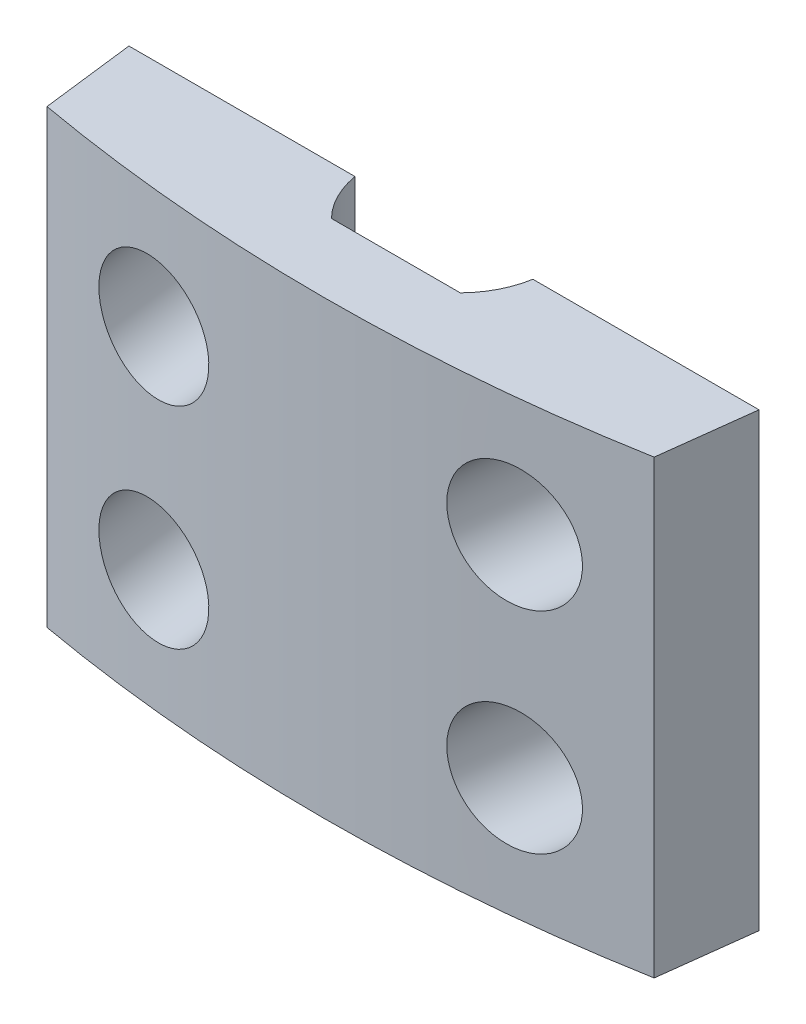
ISO-10303-21;
HEADER;
FILE_DESCRIPTION(('STEP AP214'),'2;1');
FILE_NAME('part.step','',(''),(''),'','','');
FILE_SCHEMA(('AUTOMOTIVE_DESIGN { 1 0 10303 214 1 1 1 1 }'));
ENDSEC;
DATA;
#1=APPLICATION_CONTEXT('core data for automotive mechanical design processes');
#2=APPLICATION_PROTOCOL_DEFINITION('international standard','automotive_design',2000,#1);
#3=PRODUCT_CONTEXT('',#1,'mechanical');
#4=PRODUCT('Part','Part','',(#3));
#5=PRODUCT_RELATED_PRODUCT_CATEGORY('part','',(#4));
#6=PRODUCT_DEFINITION_FORMATION('','',#4);
#7=PRODUCT_DEFINITION_CONTEXT('part definition',#1,'design');
#8=PRODUCT_DEFINITION('design','',#6,#7);
#9=PRODUCT_DEFINITION_SHAPE('','',#8);
#10=(LENGTH_UNIT() NAMED_UNIT(*) SI_UNIT(.MILLI.,.METRE.));
#11=(NAMED_UNIT(*) PLANE_ANGLE_UNIT() SI_UNIT($,.RADIAN.));
#12=(NAMED_UNIT(*) SI_UNIT($,.STERADIAN.) SOLID_ANGLE_UNIT());
#13=UNCERTAINTY_MEASURE_WITH_UNIT(LENGTH_MEASURE(1.E-05),#10,'distance_accuracy_value','');
#14=(GEOMETRIC_REPRESENTATION_CONTEXT(3) GLOBAL_UNCERTAINTY_ASSIGNED_CONTEXT((#13)) GLOBAL_UNIT_ASSIGNED_CONTEXT((#10,
#11,#12)) REPRESENTATION_CONTEXT('',''));
#15=CARTESIAN_POINT('',(0.,0.,0.));
#16=DIRECTION('',(0.,0.,1.));
#17=DIRECTION('',(1.,0.,0.));
#18=AXIS2_PLACEMENT_3D('',#15,#16,#17);
#19=CARTESIAN_POINT('',(0.,15.,-106.));
#20=DIRECTION('',(0.,-1.,0.));
#21=DIRECTION('',(0.,0.,-1.));
#22=AXIS2_PLACEMENT_3D('',#19,#20,#21);
#23=CYLINDRICAL_SURFACE('',#22,57.5);
#24=CARTESIAN_POINT('',(3.95661435391054,4.,-48.6362901927148));
#25=CARTESIAN_POINT('',(3.95661952929303,4.11074786286074,-48.6362902585238));
#26=CARTESIAN_POINT('',(3.96599528854128,4.22157654057997,-48.6369348470545));
#27=CARTESIAN_POINT('',(4.00323955156249,4.44015754764811,-48.6395222501676));
#28=CARTESIAN_POINT('',(4.03113029354431,4.54790601485162,-48.6414666259344));
#29=CARTESIAN_POINT('',(4.10452150033397,4.75710329392277,-48.6466718692401));
#30=CARTESIAN_POINT('',(4.15000777975175,4.85855710423599,-48.6499316763793));
#31=CARTESIAN_POINT('',(4.25718437837537,5.05241061889005,-48.6577881996959));
#32=CARTESIAN_POINT('',(4.31887104780056,5.14481235613977,-48.6623846147743));
#33=CARTESIAN_POINT('',(4.45709501542497,5.31872963137122,-48.672963379087));
#34=CARTESIAN_POINT('',(4.53373477096427,5.40016310806073,-48.6789553487978));
#35=CARTESIAN_POINT('',(4.69931764070986,5.54924143865315,-48.6922928339866));
#36=CARTESIAN_POINT('',(4.78826210698445,5.61688477524228,-48.6996384982409));
#37=CARTESIAN_POINT('',(4.97755343781857,5.73775117564335,-48.7157689557818));
#38=CARTESIAN_POINT('',(5.07807243720882,5.79070150883653,-48.7245766602775));
#39=CARTESIAN_POINT('',(5.28634889348932,5.87931978711516,-48.7434244464848));
#40=CARTESIAN_POINT('',(5.39410713862552,5.91498584671675,-48.7534646624973));
#41=CARTESIAN_POINT('',(5.61623763945606,5.9688141937706,-48.7748256756271));
#42=CARTESIAN_POINT('',(5.73070178701114,5.98658838583566,-48.7861691528688));
#43=CARTESIAN_POINT('',(5.96090946523823,6.00294483191391,-48.809695317304));
#44=CARTESIAN_POINT('',(6.07665313347279,6.0015250019087,-48.8218780954829));
#45=CARTESIAN_POINT('',(6.30824961728722,5.97941257177228,-48.8469617261039));
#46=CARTESIAN_POINT('',(6.42406992597594,5.95838819281517,-48.8598713362532));
#47=CARTESIAN_POINT('',(6.65052316179664,5.89716184926719,-48.8857851332226));
#48=CARTESIAN_POINT('',(6.76115578454974,5.85695876093979,-48.8987893255407));
#49=CARTESIAN_POINT('',(6.97444584422008,5.7582197947545,-48.9244475039154));
#50=CARTESIAN_POINT('',(7.07707409550045,5.69962041539417,-48.9371001091218));
#51=CARTESIAN_POINT('',(7.27084952565828,5.56562881205956,-48.9614665617376));
#52=CARTESIAN_POINT('',(7.36199742353914,5.49023764055846,-48.9731804679201));
#53=CARTESIAN_POINT('',(7.52855837270257,5.32600991642459,-48.9949321084761));
#54=CARTESIAN_POINT('',(7.60420285719571,5.2374115236655,-49.0049939682371));
#55=CARTESIAN_POINT('',(7.73908606043181,5.04831691483635,-49.0231521150987));
#56=CARTESIAN_POINT('',(7.79832783230805,4.94782291794293,-49.0312487679601));
#57=CARTESIAN_POINT('',(7.89678181820939,4.74109821022421,-49.0448137357407));
#58=CARTESIAN_POINT('',(7.93655411802077,4.63513906758414,-49.0503552413409));
#59=CARTESIAN_POINT('',(7.99732692741121,4.41787125119092,-49.0588574452802));
#60=CARTESIAN_POINT('',(8.01833102187675,4.30656360332967,-49.0618186364786));
#61=CARTESIAN_POINT('',(8.04048762987435,4.08514699056778,-49.0649433150414));
#62=CARTESIAN_POINT('',(8.04218568139366,3.975093401358,-49.065183684786));
#63=CARTESIAN_POINT('',(8.02708595972744,3.7562947707584,-49.063052875117));
#64=CARTESIAN_POINT('',(8.01028956086917,3.64754963274426,-49.060681889754));
#65=CARTESIAN_POINT('',(7.95900947517446,3.43539431398727,-49.0534915622921));
#66=CARTESIAN_POINT('',(7.9246778602838,3.33194654285604,-49.0486932740422));
#67=CARTESIAN_POINT('',(7.83954952139459,3.13220552316443,-49.0369128370587));
#68=CARTESIAN_POINT('',(7.78875181722902,3.03591270093195,-49.0299305583208));
#69=CARTESIAN_POINT('',(7.67135178366465,2.85150753532299,-49.0140024811807));
#70=CARTESIAN_POINT('',(7.60451029888297,2.76355016349338,-49.0050271416026));
#71=CARTESIAN_POINT('',(7.45749890366205,2.59978147548637,-48.9856053538529));
#72=CARTESIAN_POINT('',(7.37732706433165,2.52397192020986,-48.9751586928158));
#73=CARTESIAN_POINT('',(7.20331319561869,2.38419488703789,-48.9529125272763));
#74=CARTESIAN_POINT('',(7.10912954737935,2.32065772416187,-48.9410815395669));
#75=CARTESIAN_POINT('',(6.91168180026807,2.2099016837289,-48.9168278489762));
#76=CARTESIAN_POINT('',(6.80841631084563,2.16268531057734,-48.9044050556156));
#77=CARTESIAN_POINT('',(6.59259858140425,2.08460322708687,-48.8790777146633));
#78=CARTESIAN_POINT('',(6.47986701371682,2.05423375921646,-48.8661694333259));
#79=CARTESIAN_POINT('',(6.25088088566804,2.01269953722806,-48.8406634134166));
#80=CARTESIAN_POINT('',(6.13462600271197,2.00153654709376,-48.8280657034732));
#81=CARTESIAN_POINT('',(5.90036743338957,1.99874292251619,-48.8034118135582));
#82=CARTESIAN_POINT('',(5.78235982461745,2.00735421910124,-48.7913642000638));
#83=CARTESIAN_POINT('',(5.54941046172363,2.04449041168946,-48.7682977098299));
#84=CARTESIAN_POINT('',(5.43446866619145,2.07301503857828,-48.7572788191904));
#85=CARTESIAN_POINT('',(5.2117859181327,2.14907762029775,-48.7365760891502));
#86=CARTESIAN_POINT('',(5.10400200957335,2.19648735015307,-48.7268838267813));
#87=CARTESIAN_POINT('',(4.89806373588363,2.30913723594468,-48.7089041311129));
#88=CARTESIAN_POINT('',(4.7999080715642,2.37437498174403,-48.700616508168));
#89=CARTESIAN_POINT('',(4.61805853438772,2.51951649489181,-48.6856761641279));
#90=CARTESIAN_POINT('',(4.53412350977462,2.59911515597503,-48.6789951487642));
#91=CARTESIAN_POINT('',(4.38107845781599,2.77161342438136,-48.6670944343459));
#92=CARTESIAN_POINT('',(4.31197041998291,2.86451481390395,-48.6618749313712));
#93=CARTESIAN_POINT('',(4.19209475772085,3.05886380019279,-48.6529870755334));
#94=CARTESIAN_POINT('',(4.14097588228926,3.16009370830217,-48.6492887454384));
#95=CARTESIAN_POINT('',(4.05678166238182,3.36973628488428,-48.6432713418957));
#96=CARTESIAN_POINT('',(4.02368232206775,3.47813918444451,-48.640950433821));
#97=CARTESIAN_POINT('',(3.98565412786804,3.6560799306991,-48.638298893028));
#98=CARTESIAN_POINT('',(3.97477907278984,3.72439683373537,-48.6375455114474));
#99=CARTESIAN_POINT('',(3.96025760279521,3.86179867029688,-48.6365411429747));
#100=CARTESIAN_POINT('',(3.95661112401686,3.93088359703147,-48.6362901516442));
#101=CARTESIAN_POINT('',(3.95661435391054,4.,-48.6362901927148));
#102=B_SPLINE_CURVE_WITH_KNOTS('',3,(#24,#25,#26,#27,#28,#29,#30,#31,#32,#33,#34,#35,#36,#37,
#38,#39,#40,#41,#42,#43,#44,#45,#46,#47,#48,#49,#50,#51,#52,#53,#54,#55,#56,#57,#58,#59,#60,#61,
#62,#63,#64,#65,#66,#67,#68,#69,#70,#71,#72,#73,#74,#75,#76,#77,#78,#79,#80,#81,#82,#83,#84,#85,
#86,#87,#88,#89,#90,#91,#92,#93,#94,#95,#96,#97,#98,#99,#100,#101),.UNSPECIFIED.,.T.,.F.,(4,2,2,
2,2,2,2,2,2,2,2,2,2,2,2,2,2,2,2,2,2,2,2,2,2,2,2,2,2,2,2,2,2,2,2,2,2,2,4),(0.,0.331989185478125,
0.664377843923672,0.99649908973297,1.32854557614485,1.66295262222518,1.99739644290624,
2.33768625792847,2.67801318568234,3.02557268287748,3.37316991714532,3.72675861150849,
4.08036802620972,4.43521172864779,4.79003319650645,5.13909407384989,5.4880899346949,
5.82635004760669,6.16454553614626,6.4931599401075,6.82174992629773,7.14753745566179,
7.47334438154721,7.80434780554849,8.13539916721653,8.47651963556121,8.81769242521492,
9.16844330696425,9.51922640106504,9.87432402458491,10.2294168493083,10.5821386956156,
10.9348128816688,11.2807266223153,11.6266867493173,11.9654583025363,12.3037776178713,
12.5109698873528,12.7181603263552),.UNSPECIFIED.);
#103=CARTESIAN_POINT('',(3.95661435391054,4.,-48.6362901927148));
#104=VERTEX_POINT('',#103);
#105=EDGE_CURVE('E215',#104,#104,#102,.T.);
#106=ORIENTED_EDGE('',*,*,#105,.T.);
#107=EDGE_LOOP('',(#106));
#108=FACE_BOUND('',#107,.T.);
#109=CARTESIAN_POINT('',(3.95661435391054,11.,-48.6362901927148));
#110=CARTESIAN_POINT('',(3.95661952929303,11.1107478628607,-48.6362902585238));
#111=CARTESIAN_POINT('',(3.96599528854128,11.22157654058,-48.6369348470545));
#112=CARTESIAN_POINT('',(4.00323955156249,11.4401575476481,-48.6395222501676));
#113=CARTESIAN_POINT('',(4.03113029354431,11.5479060148516,-48.6414666259344));
#114=CARTESIAN_POINT('',(4.10452150033397,11.7571032939228,-48.6466718692401));
#115=CARTESIAN_POINT('',(4.15000777975175,11.858557104236,-48.6499316763793));
#116=CARTESIAN_POINT('',(4.25718437837537,12.05241061889,-48.6577881996959));
#117=CARTESIAN_POINT('',(4.31887104780056,12.1448123561398,-48.6623846147743));
#118=CARTESIAN_POINT('',(4.45709501542497,12.3187296313712,-48.672963379087));
#119=CARTESIAN_POINT('',(4.53373477096427,12.4001631080607,-48.6789553487978));
#120=CARTESIAN_POINT('',(4.69931764070986,12.5492414386531,-48.6922928339866));
#121=CARTESIAN_POINT('',(4.78826210698445,12.6168847752423,-48.6996384982409));
#122=CARTESIAN_POINT('',(4.97755343781857,12.7377511756433,-48.7157689557818));
#123=CARTESIAN_POINT('',(5.07807243720882,12.7907015088365,-48.7245766602775));
#124=CARTESIAN_POINT('',(5.28634889348932,12.8793197871152,-48.7434244464848));
#125=CARTESIAN_POINT('',(5.39410713862552,12.9149858467167,-48.7534646624973));
#126=CARTESIAN_POINT('',(5.61623763945606,12.9688141937706,-48.7748256756271));
#127=CARTESIAN_POINT('',(5.73070178701114,12.9865883858357,-48.7861691528688));
#128=CARTESIAN_POINT('',(5.96090946523824,13.0029448319139,-48.809695317304));
#129=CARTESIAN_POINT('',(6.07665313347279,13.0015250019087,-48.8218780954829));
#130=CARTESIAN_POINT('',(6.30824961728722,12.9794125717723,-48.8469617261039));
#131=CARTESIAN_POINT('',(6.42406992597594,12.9583881928152,-48.8598713362532));
#132=CARTESIAN_POINT('',(6.65052316179664,12.8971618492672,-48.8857851332226));
#133=CARTESIAN_POINT('',(6.76115578454974,12.8569587609398,-48.8987893255407));
#134=CARTESIAN_POINT('',(6.97444584422008,12.7582197947545,-48.9244475039154));
#135=CARTESIAN_POINT('',(7.07707409550045,12.6996204153942,-48.9371001091218));
#136=CARTESIAN_POINT('',(7.27084952565827,12.5656288120596,-48.9614665617376));
#137=CARTESIAN_POINT('',(7.36199742353914,12.4902376405585,-48.9731804679201));
#138=CARTESIAN_POINT('',(7.52855837270257,12.3260099164246,-48.9949321084761));
#139=CARTESIAN_POINT('',(7.60420285719571,12.2374115236655,-49.0049939682371));
#140=CARTESIAN_POINT('',(7.73908606043181,12.0483169148363,-49.0231521150987));
#141=CARTESIAN_POINT('',(7.79832783230805,11.9478229179429,-49.0312487679601));
#142=CARTESIAN_POINT('',(7.89678181820939,11.7410982102242,-49.0448137357407));
#143=CARTESIAN_POINT('',(7.93655411802077,11.6351390675841,-49.0503552413409));
#144=CARTESIAN_POINT('',(7.99732692741121,11.4178712511909,-49.0588574452802));
#145=CARTESIAN_POINT('',(8.01833102187675,11.3065636033297,-49.0618186364786));
#146=CARTESIAN_POINT('',(8.04048762987435,11.0851469905678,-49.0649433150414));
#147=CARTESIAN_POINT('',(8.04218568139366,10.975093401358,-49.065183684786));
#148=CARTESIAN_POINT('',(8.02708595972744,10.7562947707584,-49.063052875117));
#149=CARTESIAN_POINT('',(8.01028956086917,10.6475496327443,-49.060681889754));
#150=CARTESIAN_POINT('',(7.95900947517446,10.4353943139873,-49.0534915622921));
#151=CARTESIAN_POINT('',(7.9246778602838,10.331946542856,-49.0486932740422));
#152=CARTESIAN_POINT('',(7.83954952139459,10.1322055231644,-49.0369128370587));
#153=CARTESIAN_POINT('',(7.78875181722902,10.0359127009319,-49.0299305583208));
#154=CARTESIAN_POINT('',(7.67135178366465,9.85150753532298,-49.0140024811807));
#155=CARTESIAN_POINT('',(7.60451029888298,9.76355016349337,-49.0050271416026));
#156=CARTESIAN_POINT('',(7.45749890366205,9.59978147548636,-48.9856053538529));
#157=CARTESIAN_POINT('',(7.37732706433165,9.52397192020985,-48.9751586928158));
#158=CARTESIAN_POINT('',(7.20331319561869,9.38419488703788,-48.9529125272763));
#159=CARTESIAN_POINT('',(7.10912954737936,9.32065772416186,-48.9410815395669));
#160=CARTESIAN_POINT('',(6.91168180026807,9.2099016837289,-48.9168278489762));
#161=CARTESIAN_POINT('',(6.80841631084563,9.16268531057734,-48.9044050556156));
#162=CARTESIAN_POINT('',(6.59259858140425,9.08460322708686,-48.8790777146633));
#163=CARTESIAN_POINT('',(6.47986701371682,9.05423375921645,-48.8661694333259));
#164=CARTESIAN_POINT('',(6.25088088566804,9.01269953722805,-48.8406634134166));
#165=CARTESIAN_POINT('',(6.13462600271197,9.00153654709375,-48.8280657034732));
#166=CARTESIAN_POINT('',(5.90036743338957,8.99874292251619,-48.8034118135582));
#167=CARTESIAN_POINT('',(5.78235982461745,9.00735421910123,-48.7913642000638));
#168=CARTESIAN_POINT('',(5.54941046172363,9.04449041168945,-48.7682977098299));
#169=CARTESIAN_POINT('',(5.43446866619145,9.07301503857828,-48.7572788191904));
#170=CARTESIAN_POINT('',(5.2117859181327,9.14907762029774,-48.7365760891502));
#171=CARTESIAN_POINT('',(5.10400200957335,9.19648735015306,-48.7268838267813));
#172=CARTESIAN_POINT('',(4.89806373588363,9.30913723594467,-48.7089041311129));
#173=CARTESIAN_POINT('',(4.7999080715642,9.37437498174403,-48.700616508168));
#174=CARTESIAN_POINT('',(4.61805853438772,9.5195164948918,-48.6856761641279));
#175=CARTESIAN_POINT('',(4.53412350977462,9.59911515597503,-48.6789951487642));
#176=CARTESIAN_POINT('',(4.38107845781599,9.77161342438136,-48.6670944343459));
#177=CARTESIAN_POINT('',(4.31197041998291,9.86451481390395,-48.6618749313712));
#178=CARTESIAN_POINT('',(4.19209475772085,10.0588638001928,-48.6529870755334));
#179=CARTESIAN_POINT('',(4.14097588228926,10.1600937083022,-48.6492887454384));
#180=CARTESIAN_POINT('',(4.05678166238182,10.3697362848843,-48.6432713418957));
#181=CARTESIAN_POINT('',(4.02368232206775,10.4781391844445,-48.640950433821));
#182=CARTESIAN_POINT('',(3.98565412786804,10.6560799306991,-48.638298893028));
#183=CARTESIAN_POINT('',(3.97477907278984,10.7243968337354,-48.6375455114474));
#184=CARTESIAN_POINT('',(3.96025760279521,10.8617986702969,-48.6365411429747));
#185=CARTESIAN_POINT('',(3.95661112401686,10.9308835970315,-48.6362901516442));
#186=CARTESIAN_POINT('',(3.95661435391054,11.,-48.6362901927148));
#187=B_SPLINE_CURVE_WITH_KNOTS('',3,(#109,#110,#111,#112,#113,#114,#115,#116,#117,#118,#119,
#120,#121,#122,#123,#124,#125,#126,#127,#128,#129,#130,#131,#132,#133,#134,#135,#136,#137,#138,
#139,#140,#141,#142,#143,#144,#145,#146,#147,#148,#149,#150,#151,#152,#153,#154,#155,#156,#157,
#158,#159,#160,#161,#162,#163,#164,#165,#166,#167,#168,#169,#170,#171,#172,#173,#174,#175,#176,
#177,#178,#179,#180,#181,#182,#183,#184,#185,#186),.UNSPECIFIED.,.T.,.F.,(4,2,2,2,2,2,2,2,2,2,2,
2,2,2,2,2,2,2,2,2,2,2,2,2,2,2,2,2,2,2,2,2,2,2,2,2,2,2,4),(0.,0.331989185478125,
0.664377843923672,0.996499089732967,1.32854557614485,1.66295262222518,1.99739644290624,
2.33768625792846,2.67801318568234,3.02557268287748,3.37316991714532,3.72675861150849,
4.08036802620971,4.43521172864778,4.79003319650644,5.13909407384989,5.4880899346949,
5.82635004760669,6.16454553614626,6.4931599401075,6.82174992629773,7.14753745566179,
7.47334438154721,7.80434780554849,8.13539916721653,8.47651963556121,8.81769242521492,
9.16844330696425,9.51922640106504,9.87432402458491,10.2294168493083,10.5821386956156,
10.9348128816688,11.2807266223153,11.6266867493173,11.9654583025363,12.3037776178713,
12.5109698873528,12.7181603263552),.UNSPECIFIED.);
#188=CARTESIAN_POINT('',(3.95661435391054,11.,-48.6362901927148));
#189=VERTEX_POINT('',#188);
#190=EDGE_CURVE('E219',#189,#189,#187,.T.);
#191=ORIENTED_EDGE('',*,*,#190,.T.);
#192=EDGE_LOOP('',(#191));
#193=FACE_BOUND('',#192,.T.);
#194=CARTESIAN_POINT('',(0.,0.,-106.));
#195=DIRECTION('',(0.,1.,0.));
#196=DIRECTION('',(0.,0.,-1.));
#197=AXIS2_PLACEMENT_3D('',#194,#195,#196);
#198=CIRCLE('',#197,57.5);
#199=CARTESIAN_POINT('',(-10.0947439560084,0.,-49.3930556869333));
#200=VERTEX_POINT('',#199);
#201=CARTESIAN_POINT('',(10.0947439560084,0.,-49.3930556869333));
#202=VERTEX_POINT('',#201);
#203=EDGE_CURVE('E143',#200,#202,#198,.T.);
#204=ORIENTED_EDGE('',*,*,#203,.T.);
#205=DIRECTION('',(0.,-1.,0.));
#206=VECTOR('',#205,1.);
#207=CARTESIAN_POINT('',(10.0947439560084,15.,-49.3930556869333));
#208=LINE('',#207,#206);
#209=CARTESIAN_POINT('',(10.0947439560084,15.,-49.3930556869333));
#210=VERTEX_POINT('',#209);
#211=EDGE_CURVE('E154',#210,#202,#208,.T.);
#212=ORIENTED_EDGE('',*,*,#211,.F.);
#213=CARTESIAN_POINT('',(0.,15.,-106.));
#214=DIRECTION('',(0.,1.,0.));
#215=DIRECTION('',(0.,0.,-1.));
#216=AXIS2_PLACEMENT_3D('',#213,#214,#215);
#217=CIRCLE('',#216,57.5);
#218=CARTESIAN_POINT('',(-10.0947439560084,15.,-49.3930556869333));
#219=VERTEX_POINT('',#218);
#220=EDGE_CURVE('E245',#219,#210,#217,.T.);
#221=ORIENTED_EDGE('',*,*,#220,.F.);
#222=DIRECTION('',(0.,-1.,0.));
#223=VECTOR('',#222,1.);
#224=CARTESIAN_POINT('',(-10.0947439560084,15.,-49.3930556869333));
#225=LINE('',#224,#223);
#226=EDGE_CURVE('E157',#219,#200,#225,.T.);
#227=ORIENTED_EDGE('',*,*,#226,.T.);
#228=EDGE_LOOP('',(#204,#212,#221,#227));
#229=FACE_BOUND('',#228,.T.);
#230=CARTESIAN_POINT('',(-8.0392645655125,4.,-49.0647716677478));
#231=CARTESIAN_POINT('',(-8.03925907073716,3.89039713725964,-49.0647706011664));
#232=CARTESIAN_POINT('',(-8.02999036419628,3.78071322011193,-49.0634597622966));
#233=CARTESIAN_POINT('',(-7.99320610140402,3.56442406346574,-49.0582843011248));
#234=CARTESIAN_POINT('',(-7.96566836338105,3.45782273116552,-49.0544165743378));
#235=CARTESIAN_POINT('',(-7.89332273269215,3.25092177241171,-49.04434374216));
#236=CARTESIAN_POINT('',(-7.84853670779433,3.15061435290288,-49.0381415966231));
#237=CARTESIAN_POINT('',(-7.74316592148189,2.95887758744974,-49.0237225175983));
#238=CARTESIAN_POINT('',(-7.68258385279848,2.86744673197113,-49.0155059275242));
#239=CARTESIAN_POINT('',(-7.54638468158715,2.69436188088282,-48.9973083096476));
#240=CARTESIAN_POINT('',(-7.47054154135305,2.61288867870592,-48.9873010412305));
#241=CARTESIAN_POINT('',(-7.30669264857687,2.46345185069509,-48.966070995902));
#242=CARTESIAN_POINT('',(-7.21868473113174,2.3954906347812,-48.9548480027114));
#243=CARTESIAN_POINT('',(-7.03000618472283,2.27275572364626,-48.9312842382583));
#244=CARTESIAN_POINT('',(-6.92902336110476,2.21846645533931,-48.9189193558292));
#245=CARTESIAN_POINT('',(-6.71953006393669,2.12725905952433,-48.8938791310251));
#246=CARTESIAN_POINT('',(-6.61101850777087,2.09034343627479,-48.8812037441703));
#247=CARTESIAN_POINT('',(-6.38669819905664,2.03410519103801,-48.8556816162701));
#248=CARTESIAN_POINT('',(-6.27077620431642,2.01523183234534,-48.8428381949763));
#249=CARTESIAN_POINT('',(-6.03734365630555,1.99717880597821,-48.8177102342878));
#250=CARTESIAN_POINT('',(-5.91983301338498,1.99800025438831,-48.8054257266058));
#251=CARTESIAN_POINT('',(-5.68578517482799,2.01947230383012,-48.7816832732565));
#252=CARTESIAN_POINT('',(-5.56925882440389,2.04024818720462,-48.7702310418817));
#253=CARTESIAN_POINT('',(-5.34133822526573,2.10138011433245,-48.7485090418315));
#254=CARTESIAN_POINT('',(-5.22994375368449,2.14173530691642,-48.7382392217773));
#255=CARTESIAN_POINT('',(-5.01687201386575,2.24047140674707,-48.7191801899212));
#256=CARTESIAN_POINT('',(-4.91509787219791,2.29864005862087,-48.7103753340859));
#257=CARTESIAN_POINT('',(-4.72295864302935,2.43164346744846,-48.6942152176536));
#258=CARTESIAN_POINT('',(-4.63259229632389,2.50647638245805,-48.6868597970161));
#259=CARTESIAN_POINT('',(-4.46786636973312,2.66902569068674,-48.6737854670104));
#260=CARTESIAN_POINT('',(-4.39321319591918,2.75644205923851,-48.6680357276939));
#261=CARTESIAN_POINT('',(-4.2599456453647,2.94282333894155,-48.65797924483));
#262=CARTESIAN_POINT('',(-4.20132940077335,3.04178690325265,-48.6536723332206));
#263=CARTESIAN_POINT('',(-4.10303120231471,3.24629193318854,-48.6465561086807));
#264=CARTESIAN_POINT('',(-4.06299067888272,3.35166013475193,-48.6437183004773));
#265=CARTESIAN_POINT('',(-4.00138785002045,3.56769200517328,-48.6393875689515));
#266=CARTESIAN_POINT('',(-3.97982398669875,3.67835522674162,-48.6378945322418));
#267=CARTESIAN_POINT('',(-3.95602002601285,3.90026883206384,-48.636247964798));
#268=CARTESIAN_POINT('',(-3.95352879555588,4.01149221760444,-48.6360770254404));
#269=CARTESIAN_POINT('',(-3.96728493491549,4.23276552639425,-48.6370267824694));
#270=CARTESIAN_POINT('',(-3.98353162119843,4.34281549230042,-48.6381474317406));
#271=CARTESIAN_POINT('',(-4.03416330649362,4.5582174295029,-48.6416862150357));
#272=CARTESIAN_POINT('',(-4.06848319708526,4.66358480168625,-48.6440996922021));
#273=CARTESIAN_POINT('',(-4.15416537647589,4.86709965820045,-48.650241988543));
#274=CARTESIAN_POINT('',(-4.20552790994197,4.96524703885515,-48.6539708266011));
#275=CARTESIAN_POINT('',(-4.32412179381739,5.15224296701239,-48.6627911832828));
#276=CARTESIAN_POINT('',(-4.39145233832918,5.24102816398554,-48.6678912476357));
#277=CARTESIAN_POINT('',(-4.53979081768922,5.40621421493094,-48.679446787205));
#278=CARTESIAN_POINT('',(-4.62079962306465,5.4826142800678,-48.6859023486959));
#279=CARTESIAN_POINT('',(-4.79546816590972,5.62213879361,-48.700250746991));
#280=CARTESIAN_POINT('',(-4.88930162257183,5.68504358480335,-48.7081639560993));
#281=CARTESIAN_POINT('',(-5.08594028311095,5.79452852299566,-48.7252853018744));
#282=CARTESIAN_POINT('',(-5.18874638755446,5.84110702899961,-48.7344935685803));
#283=CARTESIAN_POINT('',(-5.40267010723379,5.91764912165608,-48.754275973609));
#284=CARTESIAN_POINT('',(-5.5139158060166,5.94724842455403,-48.7648744608728));
#285=CARTESIAN_POINT('',(-5.73967041564803,5.98767627153573,-48.7870727066209));
#286=CARTESIAN_POINT('',(-5.85417970818444,5.99850261082845,-48.7986725825454));
#287=CARTESIAN_POINT('',(-6.0855929190374,6.00123357177302,-48.8228249159936));
#288=CARTESIAN_POINT('',(-6.20249986954311,5.99276397809221,-48.8353915670584));
#289=CARTESIAN_POINT('',(-6.43321894865727,5.95640631242709,-48.8608962887208));
#290=CARTESIAN_POINT('',(-6.54703082183848,5.92851664278606,-48.8738343897929));
#291=CARTESIAN_POINT('',(-6.76936732701428,5.85370750297065,-48.8997521086645));
#292=CARTESIAN_POINT('',(-6.87783591541454,5.80662094739945,-48.9127310718556));
#293=CARTESIAN_POINT('',(-7.08521935863603,5.69461219944625,-48.938098596436));
#294=CARTESIAN_POINT('',(-7.18413474187019,5.6296909943102,-48.950487190461));
#295=CARTESIAN_POINT('',(-7.36847292058118,5.48441916943731,-48.9740044356347));
#296=CARTESIAN_POINT('',(-7.45402009700334,5.40422838739356,-48.985144389904));
#297=CARTESIAN_POINT('',(-7.61007459982504,5.23011501343443,-49.0057636438425));
#298=CARTESIAN_POINT('',(-7.68058037552024,5.13619100736285,-49.0152427722697));
#299=CARTESIAN_POINT('',(-7.802439980355,4.93999704985389,-49.0318016594935));
#300=CARTESIAN_POINT('',(-7.85425989804467,4.83802124603681,-49.0389393383062));
#301=CARTESIAN_POINT('',(-7.93949767766503,4.6266199266721,-49.0507572570223));
#302=CARTESIAN_POINT('',(-7.97294278678962,4.51720571344766,-49.055441135077));
#303=CARTESIAN_POINT('',(-8.01077913292352,4.33913070543409,-49.06075514571));
#304=CARTESIAN_POINT('',(-8.02144509099156,4.27176723839257,-49.0622579409458));
#305=CARTESIAN_POINT('',(-8.03568945049824,4.13627961907015,-49.0642665244112));
#306=CARTESIAN_POINT('',(-8.03926798238544,4.0681554808131,-49.0647723309911));
#307=CARTESIAN_POINT('',(-8.0392645655125,4.,-49.0647716677478));
#308=B_SPLINE_CURVE_WITH_KNOTS('',3,(#230,#231,#232,#233,#234,#235,#236,#237,#238,#239,#240,
#241,#242,#243,#244,#245,#246,#247,#248,#249,#250,#251,#252,#253,#254,#255,#256,#257,#258,#259,
#260,#261,#262,#263,#264,#265,#266,#267,#268,#269,#270,#271,#272,#273,#274,#275,#276,#277,#278,
#279,#280,#281,#282,#283,#284,#285,#286,#287,#288,#289,#290,#291,#292,#293,#294,#295,#296,#297,
#298,#299,#300,#301,#302,#303,#304,#305,#306,#307),.UNSPECIFIED.,.T.,.F.,(4,2,2,2,2,2,2,2,2,2,2,
2,2,2,2,2,2,2,2,2,2,2,2,2,2,2,2,2,2,2,2,2,2,2,2,2,2,2,4),(0.,0.328554796920098,
0.657509248216741,0.986048009303319,1.31453080138569,1.648294061888,1.98211679718723,
2.32648523575414,2.67090329681859,3.02368991834589,3.37649653197741,3.73153279277619,
4.08655362050182,4.43749877650142,4.78840516086032,5.13201987491236,5.47559455046867,
5.81222871344284,6.14883448973398,6.48100036015735,6.81315411400605,7.14411939358927,
7.4750894247725,7.80817195263598,8.14127568690599,8.47944721819628,8.81765273019688,
9.16286632755966,9.50812046579405,9.86012714046689,10.2121627775542,10.5673301891373,
10.9224779442109,11.2740943652745,11.6257470189941,11.9678962338037,12.3095367117387,
12.5138490970437,12.7181577218156),.UNSPECIFIED.);
#309=CARTESIAN_POINT('',(-8.0392645655125,4.,-49.0647716677478));
#310=VERTEX_POINT('',#309);
#311=EDGE_CURVE('E162',#310,#310,#308,.T.);
#312=ORIENTED_EDGE('',*,*,#311,.F.);
#313=EDGE_LOOP('',(#312));
#314=FACE_BOUND('',#313,.T.);
#315=CARTESIAN_POINT('',(-8.0392645655125,11.,-49.0647716677478));
#316=CARTESIAN_POINT('',(-8.03925907073716,10.8903971372596,-49.0647706011664));
#317=CARTESIAN_POINT('',(-8.02999036419628,10.7807132201119,-49.0634597622966));
#318=CARTESIAN_POINT('',(-7.99320610140402,10.5644240634657,-49.0582843011248));
#319=CARTESIAN_POINT('',(-7.96566836338105,10.4578227311655,-49.0544165743378));
#320=CARTESIAN_POINT('',(-7.89332273269214,10.2509217724117,-49.04434374216));
#321=CARTESIAN_POINT('',(-7.84853670779433,10.1506143529029,-49.0381415966231));
#322=CARTESIAN_POINT('',(-7.74316592148189,9.95887758744973,-49.0237225175983));
#323=CARTESIAN_POINT('',(-7.68258385279848,9.86744673197112,-49.0155059275242));
#324=CARTESIAN_POINT('',(-7.54638468158715,9.69436188088282,-48.9973083096476));
#325=CARTESIAN_POINT('',(-7.47054154135305,9.61288867870591,-48.9873010412305));
#326=CARTESIAN_POINT('',(-7.30669264857687,9.46345185069508,-48.966070995902));
#327=CARTESIAN_POINT('',(-7.21868473113174,9.39549063478119,-48.9548480027114));
#328=CARTESIAN_POINT('',(-7.03000618472283,9.27275572364625,-48.9312842382583));
#329=CARTESIAN_POINT('',(-6.92902336110476,9.2184664553393,-48.9189193558292));
#330=CARTESIAN_POINT('',(-6.71953006393669,9.12725905952432,-48.8938791310251));
#331=CARTESIAN_POINT('',(-6.61101850777087,9.09034343627478,-48.8812037441703));
#332=CARTESIAN_POINT('',(-6.38669819905664,9.034105191038,-48.8556816162701));
#333=CARTESIAN_POINT('',(-6.27077620431642,9.01523183234533,-48.8428381949763));
#334=CARTESIAN_POINT('',(-6.03734365630555,8.9971788059782,-48.8177102342878));
#335=CARTESIAN_POINT('',(-5.91983301338498,8.99800025438831,-48.8054257266058));
#336=CARTESIAN_POINT('',(-5.68578517482799,9.01947230383012,-48.7816832732565));
#337=CARTESIAN_POINT('',(-5.56925882440389,9.04024818720461,-48.7702310418817));
#338=CARTESIAN_POINT('',(-5.34133822526573,9.10138011433244,-48.7485090418315));
#339=CARTESIAN_POINT('',(-5.22994375368449,9.14173530691642,-48.7382392217773));
#340=CARTESIAN_POINT('',(-5.01687201386575,9.24047140674707,-48.7191801899212));
#341=CARTESIAN_POINT('',(-4.91509787219791,9.29864005862086,-48.7103753340859));
#342=CARTESIAN_POINT('',(-4.72295864302936,9.43164346744845,-48.6942152176536));
#343=CARTESIAN_POINT('',(-4.63259229632389,9.50647638245804,-48.6868597970161));
#344=CARTESIAN_POINT('',(-4.46786636973312,9.66902569068673,-48.6737854670104));
#345=CARTESIAN_POINT('',(-4.39321319591918,9.7564420592385,-48.6680357276939));
#346=CARTESIAN_POINT('',(-4.2599456453647,9.94282333894154,-48.65797924483));
#347=CARTESIAN_POINT('',(-4.20132940077335,10.0417869032526,-48.6536723332206));
#348=CARTESIAN_POINT('',(-4.10303120231471,10.2462919331885,-48.6465561086807));
#349=CARTESIAN_POINT('',(-4.06299067888272,10.3516601347519,-48.6437183004773));
#350=CARTESIAN_POINT('',(-4.00138785002045,10.5676920051733,-48.6393875689515));
#351=CARTESIAN_POINT('',(-3.97982398669875,10.6783552267416,-48.6378945322418));
#352=CARTESIAN_POINT('',(-3.95602002601285,10.9002688320638,-48.636247964798));
#353=CARTESIAN_POINT('',(-3.95352879555587,11.0114922176044,-48.6360770254404));
#354=CARTESIAN_POINT('',(-3.96728493491549,11.2327655263942,-48.6370267824694));
#355=CARTESIAN_POINT('',(-3.98353162119843,11.3428154923004,-48.6381474317406));
#356=CARTESIAN_POINT('',(-4.03416330649362,11.5582174295029,-48.6416862150357));
#357=CARTESIAN_POINT('',(-4.06848319708526,11.6635848016862,-48.6440996922021));
#358=CARTESIAN_POINT('',(-4.15416537647589,11.8670996582004,-48.650241988543));
#359=CARTESIAN_POINT('',(-4.20552790994197,11.9652470388551,-48.6539708266011));
#360=CARTESIAN_POINT('',(-4.32412179381739,12.1522429670124,-48.6627911832828));
#361=CARTESIAN_POINT('',(-4.39145233832918,12.2410281639855,-48.6678912476357));
#362=CARTESIAN_POINT('',(-4.53979081768922,12.4062142149309,-48.679446787205));
#363=CARTESIAN_POINT('',(-4.62079962306465,12.4826142800678,-48.6859023486959));
#364=CARTESIAN_POINT('',(-4.79546816590972,12.62213879361,-48.700250746991));
#365=CARTESIAN_POINT('',(-4.88930162257183,12.6850435848033,-48.7081639560993));
#366=CARTESIAN_POINT('',(-5.08594028311095,12.7945285229956,-48.7252853018744));
#367=CARTESIAN_POINT('',(-5.18874638755446,12.8411070289996,-48.7344935685803));
#368=CARTESIAN_POINT('',(-5.40267010723379,12.9176491216561,-48.754275973609));
#369=CARTESIAN_POINT('',(-5.5139158060166,12.947248424554,-48.7648744608728));
#370=CARTESIAN_POINT('',(-5.73967041564803,12.9876762715357,-48.7870727066209));
#371=CARTESIAN_POINT('',(-5.85417970818444,12.9985026108284,-48.7986725825454));
#372=CARTESIAN_POINT('',(-6.0855929190374,13.001233571773,-48.8228249159936));
#373=CARTESIAN_POINT('',(-6.2024998695431,12.9927639780922,-48.8353915670584));
#374=CARTESIAN_POINT('',(-6.43321894865727,12.9564063124271,-48.8608962887208));
#375=CARTESIAN_POINT('',(-6.54703082183848,12.9285166427861,-48.8738343897929));
#376=CARTESIAN_POINT('',(-6.76936732701428,12.8537075029706,-48.8997521086645));
#377=CARTESIAN_POINT('',(-6.87783591541454,12.8066209473994,-48.9127310718556));
#378=CARTESIAN_POINT('',(-7.08521935863602,12.6946121994462,-48.938098596436));
#379=CARTESIAN_POINT('',(-7.18413474187019,12.6296909943102,-48.950487190461));
#380=CARTESIAN_POINT('',(-7.36847292058118,12.4844191694373,-48.9740044356347));
#381=CARTESIAN_POINT('',(-7.45402009700334,12.4042283873935,-48.985144389904));
#382=CARTESIAN_POINT('',(-7.61007459982504,12.2301150134344,-49.0057636438425));
#383=CARTESIAN_POINT('',(-7.68058037552024,12.1361910073628,-49.0152427722697));
#384=CARTESIAN_POINT('',(-7.802439980355,11.9399970498539,-49.0318016594935));
#385=CARTESIAN_POINT('',(-7.85425989804467,11.8380212460368,-49.0389393383062));
#386=CARTESIAN_POINT('',(-7.93949767766503,11.6266199266721,-49.0507572570223));
#387=CARTESIAN_POINT('',(-7.97294278678962,11.5172057134477,-49.055441135077));
#388=CARTESIAN_POINT('',(-8.01077913292352,11.3391307054341,-49.06075514571));
#389=CARTESIAN_POINT('',(-8.02144509099156,11.2717672383926,-49.0622579409458));
#390=CARTESIAN_POINT('',(-8.03568945049824,11.1362796190701,-49.0642665244112));
#391=CARTESIAN_POINT('',(-8.03926798238544,11.0681554808131,-49.0647723309911));
#392=CARTESIAN_POINT('',(-8.0392645655125,11.,-49.0647716677478));
#393=B_SPLINE_CURVE_WITH_KNOTS('',3,(#315,#316,#317,#318,#319,#320,#321,#322,#323,#324,#325,
#326,#327,#328,#329,#330,#331,#332,#333,#334,#335,#336,#337,#338,#339,#340,#341,#342,#343,#344,
#345,#346,#347,#348,#349,#350,#351,#352,#353,#354,#355,#356,#357,#358,#359,#360,#361,#362,#363,
#364,#365,#366,#367,#368,#369,#370,#371,#372,#373,#374,#375,#376,#377,#378,#379,#380,#381,#382,
#383,#384,#385,#386,#387,#388,#389,#390,#391,#392),.UNSPECIFIED.,.T.,.F.,(4,2,2,2,2,2,2,2,2,2,2,
2,2,2,2,2,2,2,2,2,2,2,2,2,2,2,2,2,2,2,2,2,2,2,2,2,2,2,4),(0.,0.328554796920097,0.65750924821674,
0.986048009303319,1.31453080138569,1.648294061888,1.98211679718723,2.32648523575414,
2.67090329681859,3.02368991834589,3.37649653197741,3.73153279277619,4.08655362050182,
4.43749877650142,4.78840516086032,5.13201987491236,5.47559455046867,5.81222871344284,
6.14883448973398,6.48100036015734,6.81315411400605,7.14411939358927,7.4750894247725,
7.80817195263598,8.14127568690598,8.47944721819628,8.81765273019688,9.16286632755966,
9.50812046579405,9.86012714046689,10.2121627775542,10.5673301891373,10.9224779442109,
11.2740943652745,11.6257470189941,11.9678962338037,12.3095367117387,12.5138490970437,
12.7181577218156),.UNSPECIFIED.);
#394=CARTESIAN_POINT('',(-8.0392645655125,11.,-49.0647716677478));
#395=VERTEX_POINT('',#394);
#396=EDGE_CURVE('E170',#395,#395,#393,.T.);
#397=ORIENTED_EDGE('',*,*,#396,.F.);
#398=EDGE_LOOP('',(#397));
#399=FACE_BOUND('',#398,.T.);
#400=ADVANCED_FACE('F36',(#108,#193,#229,#314,#399),#23,.T.);
#401=CARTESIAN_POINT('',(0.,15.,-53.));
#402=DIRECTION('',(0.,-1.,0.));
#403=DIRECTION('',(0.,0.,-1.));
#404=AXIS2_PLACEMENT_3D('',#401,#402,#403);
#405=CYLINDRICAL_SURFACE('',#404,3.);
#406=CARTESIAN_POINT('',(0.,0.,-53.));
#407=DIRECTION('',(0.,-1.,0.));
#408=DIRECTION('',(0.,0.,1.));
#409=AXIS2_PLACEMENT_3D('',#406,#407,#408);
#410=CIRCLE('',#409,3.);
#411=CARTESIAN_POINT('',(-2.14242852856285,0.,-50.9));
#412=VERTEX_POINT('',#411);
#413=CARTESIAN_POINT('',(-2.95791458315768,0.,-52.4992592299971));
#414=VERTEX_POINT('',#413);
#415=EDGE_CURVE('E135',#412,#414,#410,.T.);
#416=ORIENTED_EDGE('',*,*,#415,.T.);
#417=DIRECTION('',(0.,-1.,0.));
#418=VECTOR('',#417,1.);
#419=CARTESIAN_POINT('',(-2.95791458315768,15.,-52.4992592299971));
#420=LINE('',#419,#418);
#421=CARTESIAN_POINT('',(-2.95791458315768,15.,-52.4992592299971));
#422=VERTEX_POINT('',#421);
#423=EDGE_CURVE('E11',#422,#414,#420,.T.);
#424=ORIENTED_EDGE('',*,*,#423,.F.);
#425=CARTESIAN_POINT('',(0.,15.,-53.));
#426=DIRECTION('',(0.,-1.,0.));
#427=DIRECTION('',(0.,0.,1.));
#428=AXIS2_PLACEMENT_3D('',#425,#426,#427);
#429=CIRCLE('',#428,3.);
#430=CARTESIAN_POINT('',(-2.14242852856285,15.,-50.9));
#431=VERTEX_POINT('',#430);
#432=EDGE_CURVE('E150',#431,#422,#429,.T.);
#433=ORIENTED_EDGE('',*,*,#432,.F.);
#434=DIRECTION('',(0.,-1.,0.));
#435=VECTOR('',#434,1.);
#436=CARTESIAN_POINT('',(-2.14242852856285,15.,-50.9));
#437=LINE('',#436,#435);
#438=EDGE_CURVE('E131',#431,#412,#437,.T.);
#439=ORIENTED_EDGE('',*,*,#438,.T.);
#440=EDGE_LOOP('',(#416,#424,#433,#439));
#441=FACE_BOUND('',#440,.T.);
#442=ADVANCED_FACE('F38',(#441),#405,.F.);
#443=CARTESIAN_POINT('',(-10.4761377941186,15.,-52.4992592299971));
#444=DIRECTION('',(0.,0.,1.));
#445=DIRECTION('',(1.,0.,0.));
#446=AXIS2_PLACEMENT_3D('',#443,#444,#445);
#447=PLANE('',#446);
#448=CARTESIAN_POINT('',(-6.4459469618521,11.,-52.4992592299971));
#449=DIRECTION('',(0.,0.,1.));
#450=DIRECTION('',(-1.,0.,0.));
#451=AXIS2_PLACEMENT_3D('',#448,#449,#450);
#452=ELLIPSE('',#451,2.0150196509177,2.);
#453=CARTESIAN_POINT('',(-8.46096661276979,11.,-52.4992592299971));
#454=VERTEX_POINT('',#453);
#455=EDGE_CURVE('E171',#454,#454,#452,.F.);
#456=ORIENTED_EDGE('',*,*,#455,.F.);
#457=EDGE_LOOP('',(#456));
#458=FACE_BOUND('',#457,.T.);
#459=CARTESIAN_POINT('',(-6.4459469618521,4.,-52.4992592299971));
#460=DIRECTION('',(0.,0.,1.));
#461=DIRECTION('',(-1.,0.,0.));
#462=AXIS2_PLACEMENT_3D('',#459,#460,#461);
#463=ELLIPSE('',#462,2.0150196509177,2.);
#464=CARTESIAN_POINT('',(-8.46096661276979,4.,-52.4992592299971));
#465=VERTEX_POINT('',#464);
#466=EDGE_CURVE('E139',#465,#465,#463,.F.);
#467=ORIENTED_EDGE('',*,*,#466,.F.);
#468=EDGE_LOOP('',(#467));
#469=FACE_BOUND('',#468,.T.);
#470=DIRECTION('',(-1.,0.,0.));
#471=VECTOR('',#470,1.);
#472=CARTESIAN_POINT('',(-10.4761377941186,0.,-52.4992592299971));
#473=LINE('',#472,#471);
#474=CARTESIAN_POINT('',(-10.4761377941186,0.,-52.4992592299971));
#475=VERTEX_POINT('',#474);
#476=EDGE_CURVE('E138',#414,#475,#473,.T.);
#477=ORIENTED_EDGE('',*,*,#476,.T.);
#478=DIRECTION('',(0.,-1.,0.));
#479=VECTOR('',#478,1.);
#480=CARTESIAN_POINT('',(-10.4761377941186,15.,-52.4992592299971));
#481=LINE('',#480,#479);
#482=CARTESIAN_POINT('',(-10.4761377941186,15.,-52.4992592299971));
#483=VERTEX_POINT('',#482);
#484=EDGE_CURVE('E46',#483,#475,#481,.T.);
#485=ORIENTED_EDGE('',*,*,#484,.F.);
#486=DIRECTION('',(-1.,0.,0.));
#487=VECTOR('',#486,1.);
#488=CARTESIAN_POINT('',(-10.4761377941186,15.,-52.4992592299971));
#489=LINE('',#488,#487);
#490=EDGE_CURVE('E98',#422,#483,#489,.T.);
#491=ORIENTED_EDGE('',*,*,#490,.F.);
#492=ORIENTED_EDGE('',*,*,#423,.T.);
#493=EDGE_LOOP('',(#477,#485,#491,#492));
#494=FACE_BOUND('',#493,.T.);
#495=ADVANCED_FACE('F204',(#458,#469,#494),#447,.F.);
#496=CARTESIAN_POINT('',(-10.0947439560084,15.,-49.3930556869333));
#497=DIRECTION('',(0.992546151641321,0.,-0.121869343405152));
#498=DIRECTION('',(-0.121869343405152,0.,-0.992546151641322));
#499=AXIS2_PLACEMENT_3D('',#496,#497,#498);
#500=PLANE('',#499);
#501=DIRECTION('',(0.121869343405152,0.,0.992546151641322));
#502=VECTOR('',#501,1.);
#503=CARTESIAN_POINT('',(-10.0947439560084,0.,-49.3930556869333));
#504=LINE('',#503,#502);
#505=EDGE_CURVE('E141',#475,#200,#504,.T.);
#506=ORIENTED_EDGE('',*,*,#505,.T.);
#507=ORIENTED_EDGE('',*,*,#226,.F.);
#508=DIRECTION('',(0.121869343405152,0.,0.992546151641322));
#509=VECTOR('',#508,1.);
#510=CARTESIAN_POINT('',(-10.0947439560084,15.,-49.3930556869333));
#511=LINE('',#510,#509);
#512=EDGE_CURVE('E243',#483,#219,#511,.T.);
#513=ORIENTED_EDGE('',*,*,#512,.F.);
#514=ORIENTED_EDGE('',*,*,#484,.T.);
#515=EDGE_LOOP('',(#506,#507,#513,#514));
#516=FACE_BOUND('',#515,.T.);
#517=ADVANCED_FACE('F199',(#516),#500,.F.);
#518=CARTESIAN_POINT('',(10.0947439560084,15.,-49.3930556869333));
#519=DIRECTION('',(-0.992546151641321,0.,-0.121869343405152));
#520=DIRECTION('',(-0.121869343405152,0.,0.992546151641322));
#521=AXIS2_PLACEMENT_3D('',#518,#519,#520);
#522=PLANE('',#521);
#523=DIRECTION('',(0.121869343405152,0.,-0.992546151641322));
#524=VECTOR('',#523,1.);
#525=CARTESIAN_POINT('',(10.0947439560084,0.,-49.3930556869333));
#526=LINE('',#525,#524);
#527=CARTESIAN_POINT('',(10.4761377941185,0.,-52.4992592299971));
#528=VERTEX_POINT('',#527);
#529=EDGE_CURVE('E145',#202,#528,#526,.T.);
#530=ORIENTED_EDGE('',*,*,#529,.T.);
#531=DIRECTION('',(0.,-1.,0.));
#532=VECTOR('',#531,1.);
#533=CARTESIAN_POINT('',(10.4761377941185,15.,-52.4992592299971));
#534=LINE('',#533,#532);
#535=CARTESIAN_POINT('',(10.4761377941185,15.,-52.4992592299971));
#536=VERTEX_POINT('',#535);
#537=EDGE_CURVE('E126',#536,#528,#534,.T.);
#538=ORIENTED_EDGE('',*,*,#537,.F.);
#539=DIRECTION('',(0.121869343405152,0.,-0.992546151641322));
#540=VECTOR('',#539,1.);
#541=CARTESIAN_POINT('',(10.0947439560084,15.,-49.3930556869333));
#542=LINE('',#541,#540);
#543=EDGE_CURVE('E117',#210,#536,#542,.T.);
#544=ORIENTED_EDGE('',*,*,#543,.F.);
#545=ORIENTED_EDGE('',*,*,#211,.T.);
#546=EDGE_LOOP('',(#530,#538,#544,#545));
#547=FACE_BOUND('',#546,.T.);
#548=ADVANCED_FACE('F196',(#547),#522,.F.);
#549=CARTESIAN_POINT('',(10.4761377941185,15.,-52.4992592299971));
#550=DIRECTION('',(0.,0.,1.));
#551=DIRECTION('',(1.,0.,0.));
#552=AXIS2_PLACEMENT_3D('',#549,#550,#551);
#553=PLANE('',#552);
#554=CARTESIAN_POINT('',(6.44594696185246,4.,-52.4992592299971));
#555=DIRECTION('',(0.,0.,1.));
#556=DIRECTION('',(1.,0.,0.));
#557=AXIS2_PLACEMENT_3D('',#554,#555,#556);
#558=ELLIPSE('',#557,2.0150196509177,2.);
#559=CARTESIAN_POINT('',(8.46096661277016,4.,-52.4992592299971));
#560=VERTEX_POINT('',#559);
#561=EDGE_CURVE('E40',#560,#560,#558,.T.);
#562=ORIENTED_EDGE('',*,*,#561,.T.);
#563=EDGE_LOOP('',(#562));
#564=FACE_BOUND('',#563,.T.);
#565=CARTESIAN_POINT('',(6.44594696185246,11.,-52.4992592299971));
#566=DIRECTION('',(0.,0.,1.));
#567=DIRECTION('',(1.,0.,0.));
#568=AXIS2_PLACEMENT_3D('',#565,#566,#567);
#569=ELLIPSE('',#568,2.0150196509177,2.);
#570=CARTESIAN_POINT('',(8.46096661277016,11.,-52.4992592299971));
#571=VERTEX_POINT('',#570);
#572=EDGE_CURVE('E282',#571,#571,#569,.T.);
#573=ORIENTED_EDGE('',*,*,#572,.T.);
#574=EDGE_LOOP('',(#573));
#575=FACE_BOUND('',#574,.T.);
#576=DIRECTION('',(-1.,0.,0.));
#577=VECTOR('',#576,1.);
#578=CARTESIAN_POINT('',(10.4761377941185,0.,-52.4992592299971));
#579=LINE('',#578,#577);
#580=CARTESIAN_POINT('',(2.95791458315769,0.,-52.4992592299971));
#581=VERTEX_POINT('',#580);
#582=EDGE_CURVE('E125',#528,#581,#579,.T.);
#583=ORIENTED_EDGE('',*,*,#582,.T.);
#584=DIRECTION('',(0.,-1.,0.));
#585=VECTOR('',#584,1.);
#586=CARTESIAN_POINT('',(2.95791458315769,15.,-52.4992592299971));
#587=LINE('',#586,#585);
#588=CARTESIAN_POINT('',(2.95791458315769,15.,-52.4992592299971));
#589=VERTEX_POINT('',#588);
#590=EDGE_CURVE('E122',#589,#581,#587,.T.);
#591=ORIENTED_EDGE('',*,*,#590,.F.);
#592=DIRECTION('',(-1.,0.,0.));
#593=VECTOR('',#592,1.);
#594=CARTESIAN_POINT('',(10.4761377941185,15.,-52.4992592299971));
#595=LINE('',#594,#593);
#596=EDGE_CURVE('E111',#536,#589,#595,.T.);
#597=ORIENTED_EDGE('',*,*,#596,.F.);
#598=ORIENTED_EDGE('',*,*,#537,.T.);
#599=EDGE_LOOP('',(#583,#591,#597,#598));
#600=FACE_BOUND('',#599,.T.);
#601=ADVANCED_FACE('F123',(#564,#575,#600),#553,.F.);
#602=CARTESIAN_POINT('',(0.,15.,-53.));
#603=DIRECTION('',(0.,-1.,0.));
#604=DIRECTION('',(0.,0.,-1.));
#605=AXIS2_PLACEMENT_3D('',#602,#603,#604);
#606=CYLINDRICAL_SURFACE('',#605,3.);
#607=CARTESIAN_POINT('',(0.,0.,-53.));
#608=DIRECTION('',(0.,-1.,0.));
#609=DIRECTION('',(0.,0.,1.));
#610=AXIS2_PLACEMENT_3D('',#607,#608,#609);
#611=CIRCLE('',#610,3.);
#612=CARTESIAN_POINT('',(2.14242852856285,0.,-50.9));
#613=VERTEX_POINT('',#612);
#614=EDGE_CURVE('E84',#581,#613,#611,.T.);
#615=ORIENTED_EDGE('',*,*,#614,.T.);
#616=DIRECTION('',(0.,-1.,0.));
#617=VECTOR('',#616,1.);
#618=CARTESIAN_POINT('',(2.14242852856285,15.,-50.9));
#619=LINE('',#618,#617);
#620=CARTESIAN_POINT('',(2.14242852856285,15.,-50.9));
#621=VERTEX_POINT('',#620);
#622=EDGE_CURVE('E127',#621,#613,#619,.T.);
#623=ORIENTED_EDGE('',*,*,#622,.F.);
#624=CARTESIAN_POINT('',(0.,15.,-53.));
#625=DIRECTION('',(0.,-1.,0.));
#626=DIRECTION('',(0.,0.,1.));
#627=AXIS2_PLACEMENT_3D('',#624,#625,#626);
#628=CIRCLE('',#627,3.);
#629=EDGE_CURVE('E115',#589,#621,#628,.T.);
#630=ORIENTED_EDGE('',*,*,#629,.F.);
#631=ORIENTED_EDGE('',*,*,#590,.T.);
#632=EDGE_LOOP('',(#615,#623,#630,#631));
#633=FACE_BOUND('',#632,.T.);
#634=ADVANCED_FACE('F129',(#633),#606,.F.);
#635=CARTESIAN_POINT('',(-2.14242852856285,15.,-50.9));
#636=DIRECTION('',(0.,0.,1.));
#637=DIRECTION('',(1.,0.,0.));
#638=AXIS2_PLACEMENT_3D('',#635,#636,#637);
#639=PLANE('',#638);
#640=DIRECTION('',(-1.,0.,0.));
#641=VECTOR('',#640,1.);
#642=CARTESIAN_POINT('',(-2.14242852856285,0.,-50.9));
#643=LINE('',#642,#641);
#644=EDGE_CURVE('E90',#613,#412,#643,.T.);
#645=ORIENTED_EDGE('',*,*,#644,.T.);
#646=ORIENTED_EDGE('',*,*,#438,.F.);
#647=DIRECTION('',(-1.,0.,0.));
#648=VECTOR('',#647,1.);
#649=CARTESIAN_POINT('',(-2.14242852856285,15.,-50.9));
#650=LINE('',#649,#648);
#651=EDGE_CURVE('E55',#621,#431,#650,.T.);
#652=ORIENTED_EDGE('',*,*,#651,.F.);
#653=ORIENTED_EDGE('',*,*,#622,.T.);
#654=EDGE_LOOP('',(#645,#646,#652,#653));
#655=FACE_BOUND('',#654,.T.);
#656=ADVANCED_FACE('F187',(#655),#639,.F.);
#657=CARTESIAN_POINT('',(0.,15.,-53.));
#658=DIRECTION('',(0.,1.,0.));
#659=DIRECTION('',(0.,0.,1.));
#660=AXIS2_PLACEMENT_3D('',#657,#658,#659);
#661=PLANE('',#660);
#662=ORIENTED_EDGE('',*,*,#432,.T.);
#663=ORIENTED_EDGE('',*,*,#490,.T.);
#664=ORIENTED_EDGE('',*,*,#512,.T.);
#665=ORIENTED_EDGE('',*,*,#220,.T.);
#666=ORIENTED_EDGE('',*,*,#543,.T.);
#667=ORIENTED_EDGE('',*,*,#596,.T.);
#668=ORIENTED_EDGE('',*,*,#629,.T.);
#669=ORIENTED_EDGE('',*,*,#651,.T.);
#670=EDGE_LOOP('',(#662,#663,#664,#665,#666,#667,#668,#669));
#671=FACE_BOUND('',#670,.T.);
#672=ADVANCED_FACE('F113',(#671),#661,.T.);
#673=CARTESIAN_POINT('',(0.,0.,-53.));
#674=DIRECTION('',(0.,1.,0.));
#675=DIRECTION('',(0.,0.,1.));
#676=AXIS2_PLACEMENT_3D('',#673,#674,#675);
#677=PLANE('',#676);
#678=ORIENTED_EDGE('',*,*,#415,.F.);
#679=ORIENTED_EDGE('',*,*,#644,.F.);
#680=ORIENTED_EDGE('',*,*,#614,.F.);
#681=ORIENTED_EDGE('',*,*,#582,.F.);
#682=ORIENTED_EDGE('',*,*,#529,.F.);
#683=ORIENTED_EDGE('',*,*,#203,.F.);
#684=ORIENTED_EDGE('',*,*,#505,.F.);
#685=ORIENTED_EDGE('',*,*,#476,.F.);
#686=EDGE_LOOP('',(#678,#679,#680,#681,#682,#683,#684,#685));
#687=FACE_BOUND('',#686,.T.);
#688=ADVANCED_FACE('F181',(#687),#677,.F.);
#689=CARTESIAN_POINT('',(-5.265811895783,4.,-42.8878304201303));
#690=DIRECTION('',(-0.121869343405155,0.,-0.992546151641321));
#691=DIRECTION('',(-0.992546151641321,0.,0.121869343405155));
#692=AXIS2_PLACEMENT_3D('',#689,#690,#691);
#693=CYLINDRICAL_SURFACE('',#692,2.);
#694=ORIENTED_EDGE('',*,*,#311,.T.);
#695=EDGE_LOOP('',(#694));
#696=FACE_BOUND('',#695,.T.);
#697=ORIENTED_EDGE('',*,*,#466,.T.);
#698=EDGE_LOOP('',(#697));
#699=FACE_BOUND('',#698,.T.);
#700=ADVANCED_FACE('F175',(#696,#699),#693,.F.);
#701=CARTESIAN_POINT('',(-5.265811895783,11.,-42.8878304201303));
#702=DIRECTION('',(-0.121869343405155,0.,-0.992546151641321));
#703=DIRECTION('',(-0.992546151641321,0.,0.121869343405155));
#704=AXIS2_PLACEMENT_3D('',#701,#702,#703);
#705=CYLINDRICAL_SURFACE('',#704,2.);
#706=ORIENTED_EDGE('',*,*,#455,.T.);
#707=EDGE_LOOP('',(#706));
#708=FACE_BOUND('',#707,.T.);
#709=ORIENTED_EDGE('',*,*,#396,.T.);
#710=EDGE_LOOP('',(#709));
#711=FACE_BOUND('',#710,.T.);
#712=ADVANCED_FACE('F180',(#708,#711),#705,.F.);
#713=CARTESIAN_POINT('',(5.26581189578344,11.,-42.8878304201303));
#714=DIRECTION('',(0.121869343405148,0.,-0.992546151641322));
#715=DIRECTION('',(-0.992546151641322,0.,-0.121869343405148));
#716=AXIS2_PLACEMENT_3D('',#713,#714,#715);
#717=CYLINDRICAL_SURFACE('',#716,2.);
#718=ORIENTED_EDGE('',*,*,#572,.F.);
#719=EDGE_LOOP('',(#718));
#720=FACE_BOUND('',#719,.T.);
#721=ORIENTED_EDGE('',*,*,#190,.F.);
#722=EDGE_LOOP('',(#721));
#723=FACE_BOUND('',#722,.T.);
#724=ADVANCED_FACE('F264',(#720,#723),#717,.F.);
#725=CARTESIAN_POINT('',(5.26581189578344,4.,-42.8878304201303));
#726=DIRECTION('',(0.121869343405148,0.,-0.992546151641322));
#727=DIRECTION('',(-0.992546151641322,0.,-0.121869343405148));
#728=AXIS2_PLACEMENT_3D('',#725,#726,#727);
#729=CYLINDRICAL_SURFACE('',#728,2.);
#730=ORIENTED_EDGE('',*,*,#561,.F.);
#731=EDGE_LOOP('',(#730));
#732=FACE_BOUND('',#731,.T.);
#733=ORIENTED_EDGE('',*,*,#105,.F.);
#734=EDGE_LOOP('',(#733));
#735=FACE_BOUND('',#734,.T.);
#736=ADVANCED_FACE('F268',(#732,#735),#729,.F.);
#737=CLOSED_SHELL('',(#400,#442,#495,#517,#548,#601,#634,#656,#672,#688,#700,#712,#724,#736));
#738=MANIFOLD_SOLID_BREP('B2',#737);
#739=ADVANCED_BREP_SHAPE_REPRESENTATION('',(#18,#738),#14);
#740=SHAPE_DEFINITION_REPRESENTATION(#9,#739);
ENDSEC;
END-ISO-10303-21;
